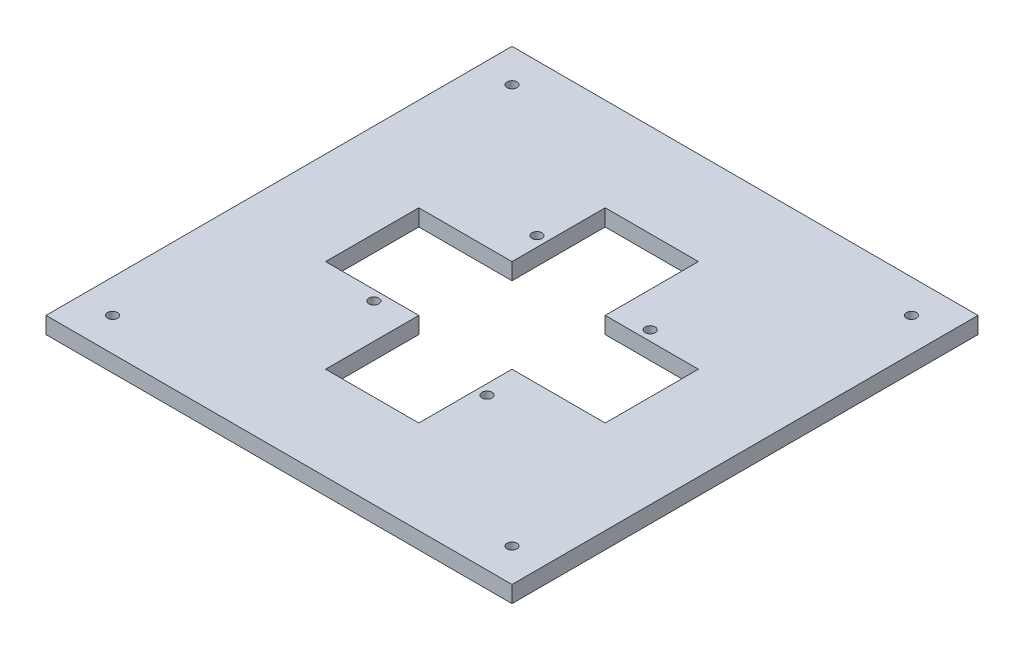
ISO-10303-21;
HEADER;
FILE_DESCRIPTION(('STEP AP214'),'2;1');
FILE_NAME('part.step','',(''),(''),'','','');
FILE_SCHEMA(('AUTOMOTIVE_DESIGN { 1 0 10303 214 1 1 1 1 }'));
ENDSEC;
DATA;
#1=APPLICATION_CONTEXT('core data for automotive mechanical design processes');
#2=APPLICATION_PROTOCOL_DEFINITION('international standard','automotive_design',2000,#1);
#3=PRODUCT_CONTEXT('',#1,'mechanical');
#4=PRODUCT('Part','Part','',(#3));
#5=PRODUCT_RELATED_PRODUCT_CATEGORY('part','',(#4));
#6=PRODUCT_DEFINITION_FORMATION('','',#4);
#7=PRODUCT_DEFINITION_CONTEXT('part definition',#1,'design');
#8=PRODUCT_DEFINITION('design','',#6,#7);
#9=PRODUCT_DEFINITION_SHAPE('','',#8);
#10=(LENGTH_UNIT() NAMED_UNIT(*) SI_UNIT(.MILLI.,.METRE.));
#11=(NAMED_UNIT(*) PLANE_ANGLE_UNIT() SI_UNIT($,.RADIAN.));
#12=(NAMED_UNIT(*) SI_UNIT($,.STERADIAN.) SOLID_ANGLE_UNIT());
#13=UNCERTAINTY_MEASURE_WITH_UNIT(LENGTH_MEASURE(1.E-05),#10,'distance_accuracy_value','');
#14=(GEOMETRIC_REPRESENTATION_CONTEXT(3) GLOBAL_UNCERTAINTY_ASSIGNED_CONTEXT((#13)) GLOBAL_UNIT_ASSIGNED_CONTEXT((#10,
#11,#12)) REPRESENTATION_CONTEXT('',''));
#15=CARTESIAN_POINT('',(0.,0.,0.));
#16=DIRECTION('',(0.,0.,1.));
#17=DIRECTION('',(1.,0.,0.));
#18=AXIS2_PLACEMENT_3D('',#15,#16,#17);
#19=CARTESIAN_POINT('',(70.,5.,-70.));
#20=DIRECTION('',(-1.,0.,0.));
#21=DIRECTION('',(0.,0.,1.));
#22=AXIS2_PLACEMENT_3D('',#19,#20,#21);
#23=PLANE('',#22);
#24=DIRECTION('',(0.,0.,-1.));
#25=VECTOR('',#24,1.);
#26=CARTESIAN_POINT('',(70.,0.,-70.));
#27=LINE('',#26,#25);
#28=CARTESIAN_POINT('',(70.,0.,70.));
#29=VERTEX_POINT('',#28);
#30=CARTESIAN_POINT('',(70.,0.,-70.));
#31=VERTEX_POINT('',#30);
#32=EDGE_CURVE('E224',#29,#31,#27,.T.);
#33=ORIENTED_EDGE('',*,*,#32,.T.);
#34=DIRECTION('',(0.,-1.,0.));
#35=VECTOR('',#34,1.);
#36=CARTESIAN_POINT('',(70.,5.,-70.));
#37=LINE('',#36,#35);
#38=CARTESIAN_POINT('',(70.,5.,-70.));
#39=VERTEX_POINT('',#38);
#40=EDGE_CURVE('E11',#39,#31,#37,.T.);
#41=ORIENTED_EDGE('',*,*,#40,.F.);
#42=DIRECTION('',(0.,0.,-1.));
#43=VECTOR('',#42,1.);
#44=CARTESIAN_POINT('',(70.,5.,-70.));
#45=LINE('',#44,#43);
#46=CARTESIAN_POINT('',(70.,5.,70.));
#47=VERTEX_POINT('',#46);
#48=EDGE_CURVE('E241',#47,#39,#45,.T.);
#49=ORIENTED_EDGE('',*,*,#48,.F.);
#50=DIRECTION('',(0.,-1.,0.));
#51=VECTOR('',#50,1.);
#52=CARTESIAN_POINT('',(70.,5.,70.));
#53=LINE('',#52,#51);
#54=EDGE_CURVE('E251',#47,#29,#53,.T.);
#55=ORIENTED_EDGE('',*,*,#54,.T.);
#56=EDGE_LOOP('',(#33,#41,#49,#55));
#57=FACE_BOUND('',#56,.T.);
#58=ADVANCED_FACE('F32',(#57),#23,.F.);
#59=CARTESIAN_POINT('',(-70.,5.,-70.));
#60=DIRECTION('',(0.,0.,1.));
#61=DIRECTION('',(1.,0.,0.));
#62=AXIS2_PLACEMENT_3D('',#59,#60,#61);
#63=PLANE('',#62);
#64=DIRECTION('',(-1.,0.,0.));
#65=VECTOR('',#64,1.);
#66=CARTESIAN_POINT('',(-70.,0.,-70.));
#67=LINE('',#66,#65);
#68=CARTESIAN_POINT('',(-70.,0.,-70.));
#69=VERTEX_POINT('',#68);
#70=EDGE_CURVE('E254',#31,#69,#67,.T.);
#71=ORIENTED_EDGE('',*,*,#70,.T.);
#72=DIRECTION('',(0.,-1.,0.));
#73=VECTOR('',#72,1.);
#74=CARTESIAN_POINT('',(-70.,5.,-70.));
#75=LINE('',#74,#73);
#76=CARTESIAN_POINT('',(-70.,5.,-70.));
#77=VERTEX_POINT('',#76);
#78=EDGE_CURVE('E39',#77,#69,#75,.T.);
#79=ORIENTED_EDGE('',*,*,#78,.F.);
#80=DIRECTION('',(-1.,0.,0.));
#81=VECTOR('',#80,1.);
#82=CARTESIAN_POINT('',(-70.,5.,-70.));
#83=LINE('',#82,#81);
#84=EDGE_CURVE('E244',#39,#77,#83,.T.);
#85=ORIENTED_EDGE('',*,*,#84,.F.);
#86=ORIENTED_EDGE('',*,*,#40,.T.);
#87=EDGE_LOOP('',(#71,#79,#85,#86));
#88=FACE_BOUND('',#87,.T.);
#89=ADVANCED_FACE('F283',(#88),#63,.F.);
#90=CARTESIAN_POINT('',(-70.,5.,-70.));
#91=DIRECTION('',(1.,0.,0.));
#92=DIRECTION('',(0.,0.,-1.));
#93=AXIS2_PLACEMENT_3D('',#90,#91,#92);
#94=PLANE('',#93);
#95=DIRECTION('',(0.,0.,1.));
#96=VECTOR('',#95,1.);
#97=CARTESIAN_POINT('',(-70.,0.,-70.));
#98=LINE('',#97,#96);
#99=CARTESIAN_POINT('',(-70.,0.,70.));
#100=VERTEX_POINT('',#99);
#101=EDGE_CURVE('E256',#69,#100,#98,.T.);
#102=ORIENTED_EDGE('',*,*,#101,.T.);
#103=DIRECTION('',(0.,-1.,0.));
#104=VECTOR('',#103,1.);
#105=CARTESIAN_POINT('',(-70.,5.,70.));
#106=LINE('',#105,#104);
#107=CARTESIAN_POINT('',(-70.,5.,70.));
#108=VERTEX_POINT('',#107);
#109=EDGE_CURVE('E261',#108,#100,#106,.T.);
#110=ORIENTED_EDGE('',*,*,#109,.F.);
#111=DIRECTION('',(0.,0.,1.));
#112=VECTOR('',#111,1.);
#113=CARTESIAN_POINT('',(-70.,5.,-70.));
#114=LINE('',#113,#112);
#115=EDGE_CURVE('E247',#77,#108,#114,.T.);
#116=ORIENTED_EDGE('',*,*,#115,.F.);
#117=ORIENTED_EDGE('',*,*,#78,.T.);
#118=EDGE_LOOP('',(#102,#110,#116,#117));
#119=FACE_BOUND('',#118,.T.);
#120=ADVANCED_FACE('F268',(#119),#94,.F.);
#121=CARTESIAN_POINT('',(-70.,5.,70.));
#122=DIRECTION('',(0.,0.,-1.));
#123=DIRECTION('',(-1.,0.,0.));
#124=AXIS2_PLACEMENT_3D('',#121,#122,#123);
#125=PLANE('',#124);
#126=DIRECTION('',(1.,0.,0.));
#127=VECTOR('',#126,1.);
#128=CARTESIAN_POINT('',(-70.,0.,70.));
#129=LINE('',#128,#127);
#130=EDGE_CURVE('E245',#100,#29,#129,.T.);
#131=ORIENTED_EDGE('',*,*,#130,.T.);
#132=ORIENTED_EDGE('',*,*,#54,.F.);
#133=DIRECTION('',(1.,0.,0.));
#134=VECTOR('',#133,1.);
#135=CARTESIAN_POINT('',(-70.,5.,70.));
#136=LINE('',#135,#134);
#137=EDGE_CURVE('E249',#108,#47,#136,.T.);
#138=ORIENTED_EDGE('',*,*,#137,.F.);
#139=ORIENTED_EDGE('',*,*,#109,.T.);
#140=EDGE_LOOP('',(#131,#132,#138,#139));
#141=FACE_BOUND('',#140,.T.);
#142=ADVANCED_FACE('F277',(#141),#125,.F.);
#143=CARTESIAN_POINT('',(0.,5.,0.));
#144=DIRECTION('',(0.,1.,0.));
#145=DIRECTION('',(0.,0.,1.));
#146=AXIS2_PLACEMENT_3D('',#143,#144,#145);
#147=PLANE('',#146);
#148=CARTESIAN_POINT('',(-60.,5.,60.));
#149=DIRECTION('',(0.,1.,0.));
#150=DIRECTION('',(0.,0.,1.));
#151=AXIS2_PLACEMENT_3D('',#148,#149,#150);
#152=CIRCLE('',#151,1.5);
#153=CARTESIAN_POINT('',(-60.,5.,61.5));
#154=VERTEX_POINT('',#153);
#155=EDGE_CURVE('E394',#154,#154,#152,.T.);
#156=ORIENTED_EDGE('',*,*,#155,.F.);
#157=EDGE_LOOP('',(#156));
#158=FACE_BOUND('',#157,.T.);
#159=CARTESIAN_POINT('',(60.,5.,60.));
#160=DIRECTION('',(0.,1.,0.));
#161=DIRECTION('',(0.,0.,1.));
#162=AXIS2_PLACEMENT_3D('',#159,#160,#161);
#163=CIRCLE('',#162,1.49999999999999);
#164=CARTESIAN_POINT('',(60.,5.,61.5));
#165=VERTEX_POINT('',#164);
#166=EDGE_CURVE('E388',#165,#165,#163,.T.);
#167=ORIENTED_EDGE('',*,*,#166,.F.);
#168=EDGE_LOOP('',(#167));
#169=FACE_BOUND('',#168,.T.);
#170=CARTESIAN_POINT('',(60.,5.,-60.));
#171=DIRECTION('',(0.,1.,0.));
#172=DIRECTION('',(0.,0.,1.));
#173=AXIS2_PLACEMENT_3D('',#170,#171,#172);
#174=CIRCLE('',#173,1.5);
#175=CARTESIAN_POINT('',(60.,5.,-58.5));
#176=VERTEX_POINT('',#175);
#177=EDGE_CURVE('E381',#176,#176,#174,.T.);
#178=ORIENTED_EDGE('',*,*,#177,.F.);
#179=EDGE_LOOP('',(#178));
#180=FACE_BOUND('',#179,.T.);
#181=CARTESIAN_POINT('',(-60.,5.,-60.));
#182=DIRECTION('',(0.,1.,0.));
#183=DIRECTION('',(0.,0.,1.));
#184=AXIS2_PLACEMENT_3D('',#181,#182,#183);
#185=CIRCLE('',#184,1.5);
#186=CARTESIAN_POINT('',(-60.,5.,-58.5));
#187=VERTEX_POINT('',#186);
#188=EDGE_CURVE('E385',#187,#187,#185,.T.);
#189=ORIENTED_EDGE('',*,*,#188,.F.);
#190=EDGE_LOOP('',(#189));
#191=FACE_BOUND('',#190,.T.);
#192=DIRECTION('',(-1.,0.,0.));
#193=VECTOR('',#192,1.);
#194=CARTESIAN_POINT('',(14.,5.,-14.));
#195=LINE('',#194,#193);
#196=CARTESIAN_POINT('',(42.,5.,-14.));
#197=VERTEX_POINT('',#196);
#198=CARTESIAN_POINT('',(14.,5.,-14.));
#199=VERTEX_POINT('',#198);
#200=EDGE_CURVE('E46',#197,#199,#195,.T.);
#201=ORIENTED_EDGE('',*,*,#200,.F.);
#202=DIRECTION('',(0.,0.,-1.));
#203=VECTOR('',#202,1.);
#204=CARTESIAN_POINT('',(42.,5.,-14.));
#205=LINE('',#204,#203);
#206=CARTESIAN_POINT('',(42.,5.,14.));
#207=VERTEX_POINT('',#206);
#208=EDGE_CURVE('E190',#207,#197,#205,.T.);
#209=ORIENTED_EDGE('',*,*,#208,.F.);
#210=DIRECTION('',(1.,0.,0.));
#211=VECTOR('',#210,1.);
#212=CARTESIAN_POINT('',(42.,5.,14.));
#213=LINE('',#212,#211);
#214=CARTESIAN_POINT('',(14.,5.,14.));
#215=VERTEX_POINT('',#214);
#216=EDGE_CURVE('E187',#215,#207,#213,.T.);
#217=ORIENTED_EDGE('',*,*,#216,.F.);
#218=DIRECTION('',(0.,0.,-1.));
#219=VECTOR('',#218,1.);
#220=CARTESIAN_POINT('',(14.,5.,14.));
#221=LINE('',#220,#219);
#222=CARTESIAN_POINT('',(14.,5.,42.));
#223=VERTEX_POINT('',#222);
#224=EDGE_CURVE('E184',#223,#215,#221,.T.);
#225=ORIENTED_EDGE('',*,*,#224,.F.);
#226=DIRECTION('',(1.,0.,0.));
#227=VECTOR('',#226,1.);
#228=CARTESIAN_POINT('',(14.,5.,42.));
#229=LINE('',#228,#227);
#230=CARTESIAN_POINT('',(-14.,5.,42.));
#231=VERTEX_POINT('',#230);
#232=EDGE_CURVE('E181',#231,#223,#229,.T.);
#233=ORIENTED_EDGE('',*,*,#232,.F.);
#234=DIRECTION('',(0.,0.,1.));
#235=VECTOR('',#234,1.);
#236=CARTESIAN_POINT('',(-14.,5.,42.));
#237=LINE('',#236,#235);
#238=CARTESIAN_POINT('',(-14.,5.,14.));
#239=VERTEX_POINT('',#238);
#240=EDGE_CURVE('E178',#239,#231,#237,.T.);
#241=ORIENTED_EDGE('',*,*,#240,.F.);
#242=DIRECTION('',(1.,0.,0.));
#243=VECTOR('',#242,1.);
#244=CARTESIAN_POINT('',(-14.,5.,14.));
#245=LINE('',#244,#243);
#246=CARTESIAN_POINT('',(-42.,5.,14.));
#247=VERTEX_POINT('',#246);
#248=EDGE_CURVE('E175',#247,#239,#245,.T.);
#249=ORIENTED_EDGE('',*,*,#248,.F.);
#250=DIRECTION('',(0.,0.,1.));
#251=VECTOR('',#250,1.);
#252=CARTESIAN_POINT('',(-42.,5.,14.));
#253=LINE('',#252,#251);
#254=CARTESIAN_POINT('',(-42.,5.,-14.));
#255=VERTEX_POINT('',#254);
#256=EDGE_CURVE('E172',#255,#247,#253,.T.);
#257=ORIENTED_EDGE('',*,*,#256,.F.);
#258=DIRECTION('',(-1.,0.,0.));
#259=VECTOR('',#258,1.);
#260=CARTESIAN_POINT('',(-42.,5.,-14.));
#261=LINE('',#260,#259);
#262=CARTESIAN_POINT('',(-14.,5.,-14.));
#263=VERTEX_POINT('',#262);
#264=EDGE_CURVE('E166',#263,#255,#261,.T.);
#265=ORIENTED_EDGE('',*,*,#264,.F.);
#266=DIRECTION('',(0.,0.,1.));
#267=VECTOR('',#266,1.);
#268=CARTESIAN_POINT('',(-14.,5.,-42.));
#269=LINE('',#268,#267);
#270=CARTESIAN_POINT('',(-14.,5.,-42.));
#271=VERTEX_POINT('',#270);
#272=EDGE_CURVE('E164',#271,#263,#269,.T.);
#273=ORIENTED_EDGE('',*,*,#272,.F.);
#274=DIRECTION('',(-1.,0.,0.));
#275=VECTOR('',#274,1.);
#276=CARTESIAN_POINT('',(-14.,5.,-42.));
#277=LINE('',#276,#275);
#278=CARTESIAN_POINT('',(14.,5.,-42.));
#279=VERTEX_POINT('',#278);
#280=EDGE_CURVE('E147',#279,#271,#277,.T.);
#281=ORIENTED_EDGE('',*,*,#280,.F.);
#282=DIRECTION('',(0.,0.,-1.));
#283=VECTOR('',#282,1.);
#284=CARTESIAN_POINT('',(14.,5.,-42.));
#285=LINE('',#284,#283);
#286=EDGE_CURVE('E156',#199,#279,#285,.T.);
#287=ORIENTED_EDGE('',*,*,#286,.F.);
#288=EDGE_LOOP('',(#201,#209,#217,#225,#233,#241,#249,#257,#265,#273,#281,#287));
#289=FACE_BOUND('',#288,.T.);
#290=CARTESIAN_POINT('',(24.505,5.,-17.0050000000008));
#291=DIRECTION('',(0.,1.,0.));
#292=DIRECTION('',(0.,0.,1.));
#293=AXIS2_PLACEMENT_3D('',#290,#291,#292);
#294=CIRCLE('',#293,1.5);
#295=CARTESIAN_POINT('',(24.505,5.,-15.5050000000008));
#296=VERTEX_POINT('',#295);
#297=EDGE_CURVE('E220',#296,#296,#294,.F.);
#298=ORIENTED_EDGE('',*,*,#297,.T.);
#299=EDGE_LOOP('',(#298));
#300=FACE_BOUND('',#299,.T.);
#301=CARTESIAN_POINT('',(-17.005,5.,-24.5050000000008));
#302=DIRECTION('',(0.,1.,0.));
#303=DIRECTION('',(0.,0.,1.));
#304=AXIS2_PLACEMENT_3D('',#301,#302,#303);
#305=CIRCLE('',#304,1.5);
#306=CARTESIAN_POINT('',(-17.005,5.,-23.0050000000008));
#307=VERTEX_POINT('',#306);
#308=EDGE_CURVE('E221',#307,#307,#305,.F.);
#309=ORIENTED_EDGE('',*,*,#308,.T.);
#310=EDGE_LOOP('',(#309));
#311=FACE_BOUND('',#310,.T.);
#312=CARTESIAN_POINT('',(-24.505,5.,17.0049999999992));
#313=DIRECTION('',(0.,1.,0.));
#314=DIRECTION('',(0.,0.,1.));
#315=AXIS2_PLACEMENT_3D('',#312,#313,#314);
#316=CIRCLE('',#315,1.5);
#317=CARTESIAN_POINT('',(-24.505,5.,18.5049999999992));
#318=VERTEX_POINT('',#317);
#319=EDGE_CURVE('E228',#318,#318,#316,.F.);
#320=ORIENTED_EDGE('',*,*,#319,.T.);
#321=EDGE_LOOP('',(#320));
#322=FACE_BOUND('',#321,.T.);
#323=CARTESIAN_POINT('',(17.005,5.,24.5049999999992));
#324=DIRECTION('',(0.,1.,0.));
#325=DIRECTION('',(0.,0.,1.));
#326=AXIS2_PLACEMENT_3D('',#323,#324,#325);
#327=CIRCLE('',#326,1.5);
#328=CARTESIAN_POINT('',(17.005,5.,26.0049999999992));
#329=VERTEX_POINT('',#328);
#330=EDGE_CURVE('E234',#329,#329,#327,.F.);
#331=ORIENTED_EDGE('',*,*,#330,.T.);
#332=EDGE_LOOP('',(#331));
#333=FACE_BOUND('',#332,.T.);
#334=ORIENTED_EDGE('',*,*,#48,.T.);
#335=ORIENTED_EDGE('',*,*,#84,.T.);
#336=ORIENTED_EDGE('',*,*,#115,.T.);
#337=ORIENTED_EDGE('',*,*,#137,.T.);
#338=EDGE_LOOP('',(#334,#335,#336,#337));
#339=FACE_BOUND('',#338,.T.);
#340=ADVANCED_FACE('F160',(#158,#169,#180,#191,#289,#300,#311,#322,#333,#339),#147,.T.);
#341=CARTESIAN_POINT('',(0.,0.,0.));
#342=DIRECTION('',(0.,1.,0.));
#343=DIRECTION('',(0.,0.,1.));
#344=AXIS2_PLACEMENT_3D('',#341,#342,#343);
#345=PLANE('',#344);
#346=CARTESIAN_POINT('',(-60.,0.,60.));
#347=DIRECTION('',(0.,1.,0.));
#348=DIRECTION('',(0.,0.,1.));
#349=AXIS2_PLACEMENT_3D('',#346,#347,#348);
#350=CIRCLE('',#349,1.5);
#351=CARTESIAN_POINT('',(-60.,0.,61.5));
#352=VERTEX_POINT('',#351);
#353=EDGE_CURVE('E392',#352,#352,#350,.F.);
#354=ORIENTED_EDGE('',*,*,#353,.F.);
#355=EDGE_LOOP('',(#354));
#356=FACE_BOUND('',#355,.T.);
#357=CARTESIAN_POINT('',(60.,0.,60.));
#358=DIRECTION('',(0.,1.,0.));
#359=DIRECTION('',(0.,0.,1.));
#360=AXIS2_PLACEMENT_3D('',#357,#358,#359);
#361=CIRCLE('',#360,1.49999999999999);
#362=CARTESIAN_POINT('',(60.,0.,61.5));
#363=VERTEX_POINT('',#362);
#364=EDGE_CURVE('E383',#363,#363,#361,.F.);
#365=ORIENTED_EDGE('',*,*,#364,.F.);
#366=EDGE_LOOP('',(#365));
#367=FACE_BOUND('',#366,.T.);
#368=CARTESIAN_POINT('',(60.,0.,-60.));
#369=DIRECTION('',(0.,1.,0.));
#370=DIRECTION('',(0.,0.,1.));
#371=AXIS2_PLACEMENT_3D('',#368,#369,#370);
#372=CIRCLE('',#371,1.5);
#373=CARTESIAN_POINT('',(60.,0.,-58.5));
#374=VERTEX_POINT('',#373);
#375=EDGE_CURVE('E378',#374,#374,#372,.F.);
#376=ORIENTED_EDGE('',*,*,#375,.F.);
#377=EDGE_LOOP('',(#376));
#378=FACE_BOUND('',#377,.T.);
#379=CARTESIAN_POINT('',(-60.,0.,-60.));
#380=DIRECTION('',(0.,1.,0.));
#381=DIRECTION('',(0.,0.,1.));
#382=AXIS2_PLACEMENT_3D('',#379,#380,#381);
#383=CIRCLE('',#382,1.5);
#384=CARTESIAN_POINT('',(-60.,0.,-58.5));
#385=VERTEX_POINT('',#384);
#386=EDGE_CURVE('E401',#385,#385,#383,.F.);
#387=ORIENTED_EDGE('',*,*,#386,.F.);
#388=EDGE_LOOP('',(#387));
#389=FACE_BOUND('',#388,.T.);
#390=DIRECTION('',(0.,0.,1.));
#391=VECTOR('',#390,1.);
#392=CARTESIAN_POINT('',(42.,0.,-14.));
#393=LINE('',#392,#391);
#394=CARTESIAN_POINT('',(42.,0.,-14.));
#395=VERTEX_POINT('',#394);
#396=CARTESIAN_POINT('',(42.,0.,14.));
#397=VERTEX_POINT('',#396);
#398=EDGE_CURVE('E421',#395,#397,#393,.T.);
#399=ORIENTED_EDGE('',*,*,#398,.F.);
#400=DIRECTION('',(1.,0.,0.));
#401=VECTOR('',#400,1.);
#402=CARTESIAN_POINT('',(14.,0.,-14.));
#403=LINE('',#402,#401);
#404=CARTESIAN_POINT('',(14.,0.,-14.));
#405=VERTEX_POINT('',#404);
#406=EDGE_CURVE('E216',#405,#395,#403,.T.);
#407=ORIENTED_EDGE('',*,*,#406,.F.);
#408=DIRECTION('',(0.,0.,1.));
#409=VECTOR('',#408,1.);
#410=CARTESIAN_POINT('',(14.,0.,-42.));
#411=LINE('',#410,#409);
#412=CARTESIAN_POINT('',(14.,0.,-42.));
#413=VERTEX_POINT('',#412);
#414=EDGE_CURVE('E213',#413,#405,#411,.T.);
#415=ORIENTED_EDGE('',*,*,#414,.F.);
#416=DIRECTION('',(1.,0.,0.));
#417=VECTOR('',#416,1.);
#418=CARTESIAN_POINT('',(-14.,0.,-42.));
#419=LINE('',#418,#417);
#420=CARTESIAN_POINT('',(-14.,0.,-42.));
#421=VERTEX_POINT('',#420);
#422=EDGE_CURVE('E150',#421,#413,#419,.T.);
#423=ORIENTED_EDGE('',*,*,#422,.F.);
#424=DIRECTION('',(0.,0.,-1.));
#425=VECTOR('',#424,1.);
#426=CARTESIAN_POINT('',(-14.,0.,-42.));
#427=LINE('',#426,#425);
#428=CARTESIAN_POINT('',(-14.,0.,-14.));
#429=VERTEX_POINT('',#428);
#430=EDGE_CURVE('E405',#429,#421,#427,.T.);
#431=ORIENTED_EDGE('',*,*,#430,.F.);
#432=DIRECTION('',(1.,0.,0.));
#433=VECTOR('',#432,1.);
#434=CARTESIAN_POINT('',(-42.,0.,-14.));
#435=LINE('',#434,#433);
#436=CARTESIAN_POINT('',(-42.,0.,-14.));
#437=VERTEX_POINT('',#436);
#438=EDGE_CURVE('E407',#437,#429,#435,.T.);
#439=ORIENTED_EDGE('',*,*,#438,.F.);
#440=DIRECTION('',(0.,0.,-1.));
#441=VECTOR('',#440,1.);
#442=CARTESIAN_POINT('',(-42.,0.,14.));
#443=LINE('',#442,#441);
#444=CARTESIAN_POINT('',(-42.,0.,14.));
#445=VERTEX_POINT('',#444);
#446=EDGE_CURVE('E409',#445,#437,#443,.T.);
#447=ORIENTED_EDGE('',*,*,#446,.F.);
#448=DIRECTION('',(-1.,0.,0.));
#449=VECTOR('',#448,1.);
#450=CARTESIAN_POINT('',(-14.,0.,14.));
#451=LINE('',#450,#449);
#452=CARTESIAN_POINT('',(-14.,0.,14.));
#453=VERTEX_POINT('',#452);
#454=EDGE_CURVE('E411',#453,#445,#451,.T.);
#455=ORIENTED_EDGE('',*,*,#454,.F.);
#456=DIRECTION('',(0.,0.,-1.));
#457=VECTOR('',#456,1.);
#458=CARTESIAN_POINT('',(-14.,0.,42.));
#459=LINE('',#458,#457);
#460=CARTESIAN_POINT('',(-14.,0.,42.));
#461=VERTEX_POINT('',#460);
#462=EDGE_CURVE('E413',#461,#453,#459,.T.);
#463=ORIENTED_EDGE('',*,*,#462,.F.);
#464=DIRECTION('',(-1.,0.,0.));
#465=VECTOR('',#464,1.);
#466=CARTESIAN_POINT('',(14.,0.,42.));
#467=LINE('',#466,#465);
#468=CARTESIAN_POINT('',(14.,0.,42.));
#469=VERTEX_POINT('',#468);
#470=EDGE_CURVE('E415',#469,#461,#467,.T.);
#471=ORIENTED_EDGE('',*,*,#470,.F.);
#472=DIRECTION('',(0.,0.,1.));
#473=VECTOR('',#472,1.);
#474=CARTESIAN_POINT('',(14.,0.,14.));
#475=LINE('',#474,#473);
#476=CARTESIAN_POINT('',(14.,0.,14.));
#477=VERTEX_POINT('',#476);
#478=EDGE_CURVE('E417',#477,#469,#475,.T.);
#479=ORIENTED_EDGE('',*,*,#478,.F.);
#480=DIRECTION('',(-1.,0.,0.));
#481=VECTOR('',#480,1.);
#482=CARTESIAN_POINT('',(42.,0.,14.));
#483=LINE('',#482,#481);
#484=EDGE_CURVE('E419',#397,#477,#483,.T.);
#485=ORIENTED_EDGE('',*,*,#484,.F.);
#486=EDGE_LOOP('',(#399,#407,#415,#423,#431,#439,#447,#455,#463,#471,#479,#485));
#487=FACE_BOUND('',#486,.T.);
#488=CARTESIAN_POINT('',(24.505,0.,-17.0050000000008));
#489=DIRECTION('',(0.,-1.,0.));
#490=DIRECTION('',(0.,0.,-1.));
#491=AXIS2_PLACEMENT_3D('',#488,#489,#490);
#492=CIRCLE('',#491,1.5);
#493=CARTESIAN_POINT('',(24.505,0.,-18.5050000000008));
#494=VERTEX_POINT('',#493);
#495=EDGE_CURVE('E217',#494,#494,#492,.T.);
#496=ORIENTED_EDGE('',*,*,#495,.F.);
#497=EDGE_LOOP('',(#496));
#498=FACE_BOUND('',#497,.T.);
#499=CARTESIAN_POINT('',(-17.005,0.,-24.5050000000008));
#500=DIRECTION('',(0.,-1.,0.));
#501=DIRECTION('',(0.,0.,-1.));
#502=AXIS2_PLACEMENT_3D('',#499,#500,#501);
#503=CIRCLE('',#502,1.5);
#504=CARTESIAN_POINT('',(-17.005,0.,-26.0050000000008));
#505=VERTEX_POINT('',#504);
#506=EDGE_CURVE('E225',#505,#505,#503,.T.);
#507=ORIENTED_EDGE('',*,*,#506,.F.);
#508=EDGE_LOOP('',(#507));
#509=FACE_BOUND('',#508,.T.);
#510=CARTESIAN_POINT('',(-24.505,0.,17.0049999999992));
#511=DIRECTION('',(0.,-1.,0.));
#512=DIRECTION('',(0.,0.,-1.));
#513=AXIS2_PLACEMENT_3D('',#510,#511,#512);
#514=CIRCLE('',#513,1.5);
#515=CARTESIAN_POINT('',(-24.505,0.,15.5049999999992));
#516=VERTEX_POINT('',#515);
#517=EDGE_CURVE('E231',#516,#516,#514,.T.);
#518=ORIENTED_EDGE('',*,*,#517,.F.);
#519=EDGE_LOOP('',(#518));
#520=FACE_BOUND('',#519,.T.);
#521=CARTESIAN_POINT('',(17.005,0.,24.5049999999992));
#522=DIRECTION('',(0.,-1.,0.));
#523=DIRECTION('',(0.,0.,-1.));
#524=AXIS2_PLACEMENT_3D('',#521,#522,#523);
#525=CIRCLE('',#524,1.5);
#526=CARTESIAN_POINT('',(17.005,0.,23.0049999999992));
#527=VERTEX_POINT('',#526);
#528=EDGE_CURVE('E215',#527,#527,#525,.T.);
#529=ORIENTED_EDGE('',*,*,#528,.F.);
#530=EDGE_LOOP('',(#529));
#531=FACE_BOUND('',#530,.T.);
#532=ORIENTED_EDGE('',*,*,#32,.F.);
#533=ORIENTED_EDGE('',*,*,#130,.F.);
#534=ORIENTED_EDGE('',*,*,#101,.F.);
#535=ORIENTED_EDGE('',*,*,#70,.F.);
#536=EDGE_LOOP('',(#532,#533,#534,#535));
#537=FACE_BOUND('',#536,.T.);
#538=ADVANCED_FACE('F274',(#356,#367,#378,#389,#487,#498,#509,#520,#531,#537),#345,.F.);
#539=CARTESIAN_POINT('',(17.005,9.2426406871193,24.5049999999992));
#540=DIRECTION('',(0.,-1.,0.));
#541=DIRECTION('',(0.,0.,-1.));
#542=AXIS2_PLACEMENT_3D('',#539,#540,#541);
#543=CYLINDRICAL_SURFACE('',#542,1.5);
#544=ORIENTED_EDGE('',*,*,#528,.T.);
#545=EDGE_LOOP('',(#544));
#546=FACE_BOUND('',#545,.T.);
#547=ORIENTED_EDGE('',*,*,#330,.F.);
#548=EDGE_LOOP('',(#547));
#549=FACE_BOUND('',#548,.T.);
#550=ADVANCED_FACE('F295',(#546,#549),#543,.F.);
#551=CARTESIAN_POINT('',(-24.505,9.2426406871193,17.0049999999992));
#552=DIRECTION('',(0.,-1.,0.));
#553=DIRECTION('',(0.,0.,-1.));
#554=AXIS2_PLACEMENT_3D('',#551,#552,#553);
#555=CYLINDRICAL_SURFACE('',#554,1.5);
#556=ORIENTED_EDGE('',*,*,#517,.T.);
#557=EDGE_LOOP('',(#556));
#558=FACE_BOUND('',#557,.T.);
#559=ORIENTED_EDGE('',*,*,#319,.F.);
#560=EDGE_LOOP('',(#559));
#561=FACE_BOUND('',#560,.T.);
#562=ADVANCED_FACE('F302',(#558,#561),#555,.F.);
#563=CARTESIAN_POINT('',(-17.005,9.2426406871193,-24.5050000000008));
#564=DIRECTION('',(0.,-1.,0.));
#565=DIRECTION('',(0.,0.,-1.));
#566=AXIS2_PLACEMENT_3D('',#563,#564,#565);
#567=CYLINDRICAL_SURFACE('',#566,1.5);
#568=ORIENTED_EDGE('',*,*,#506,.T.);
#569=EDGE_LOOP('',(#568));
#570=FACE_BOUND('',#569,.T.);
#571=ORIENTED_EDGE('',*,*,#308,.F.);
#572=EDGE_LOOP('',(#571));
#573=FACE_BOUND('',#572,.T.);
#574=ADVANCED_FACE('F306',(#570,#573),#567,.F.);
#575=CARTESIAN_POINT('',(24.505,9.2426406871193,-17.0050000000008));
#576=DIRECTION('',(0.,-1.,0.));
#577=DIRECTION('',(0.,0.,-1.));
#578=AXIS2_PLACEMENT_3D('',#575,#576,#577);
#579=CYLINDRICAL_SURFACE('',#578,1.5);
#580=ORIENTED_EDGE('',*,*,#495,.T.);
#581=EDGE_LOOP('',(#580));
#582=FACE_BOUND('',#581,.T.);
#583=ORIENTED_EDGE('',*,*,#297,.F.);
#584=EDGE_LOOP('',(#583));
#585=FACE_BOUND('',#584,.T.);
#586=ADVANCED_FACE('F310',(#582,#585),#579,.F.);
#587=CARTESIAN_POINT('',(14.,-118.79393923934,-14.));
#588=DIRECTION('',(0.,0.,-1.));
#589=DIRECTION('',(-1.,0.,0.));
#590=AXIS2_PLACEMENT_3D('',#587,#588,#589);
#591=PLANE('',#590);
#592=ORIENTED_EDGE('',*,*,#406,.T.);
#593=DIRECTION('',(0.,1.,0.));
#594=VECTOR('',#593,1.);
#595=CARTESIAN_POINT('',(42.,-118.79393923934,-14.));
#596=LINE('',#595,#594);
#597=EDGE_CURVE('E193',#395,#197,#596,.T.);
#598=ORIENTED_EDGE('',*,*,#597,.T.);
#599=ORIENTED_EDGE('',*,*,#200,.T.);
#600=DIRECTION('',(0.,1.,0.));
#601=VECTOR('',#600,1.);
#602=CARTESIAN_POINT('',(14.,-118.79393923934,-14.));
#603=LINE('',#602,#601);
#604=EDGE_CURVE('E153',#405,#199,#603,.T.);
#605=ORIENTED_EDGE('',*,*,#604,.F.);
#606=EDGE_LOOP('',(#592,#598,#599,#605));
#607=FACE_BOUND('',#606,.T.);
#608=ADVANCED_FACE('F314',(#607),#591,.F.);
#609=CARTESIAN_POINT('',(42.,-118.79393923934,-14.));
#610=DIRECTION('',(1.,0.,0.));
#611=DIRECTION('',(0.,0.,-1.));
#612=AXIS2_PLACEMENT_3D('',#609,#610,#611);
#613=PLANE('',#612);
#614=ORIENTED_EDGE('',*,*,#398,.T.);
#615=DIRECTION('',(0.,1.,0.));
#616=VECTOR('',#615,1.);
#617=CARTESIAN_POINT('',(42.,-118.79393923934,14.));
#618=LINE('',#617,#616);
#619=EDGE_CURVE('E195',#397,#207,#618,.T.);
#620=ORIENTED_EDGE('',*,*,#619,.T.);
#621=ORIENTED_EDGE('',*,*,#208,.T.);
#622=ORIENTED_EDGE('',*,*,#597,.F.);
#623=EDGE_LOOP('',(#614,#620,#621,#622));
#624=FACE_BOUND('',#623,.T.);
#625=ADVANCED_FACE('F318',(#624),#613,.F.);
#626=CARTESIAN_POINT('',(42.,-118.79393923934,14.));
#627=DIRECTION('',(0.,0.,1.));
#628=DIRECTION('',(1.,0.,0.));
#629=AXIS2_PLACEMENT_3D('',#626,#627,#628);
#630=PLANE('',#629);
#631=ORIENTED_EDGE('',*,*,#484,.T.);
#632=DIRECTION('',(0.,1.,0.));
#633=VECTOR('',#632,1.);
#634=CARTESIAN_POINT('',(14.,-118.79393923934,14.));
#635=LINE('',#634,#633);
#636=EDGE_CURVE('E197',#477,#215,#635,.T.);
#637=ORIENTED_EDGE('',*,*,#636,.T.);
#638=ORIENTED_EDGE('',*,*,#216,.T.);
#639=ORIENTED_EDGE('',*,*,#619,.F.);
#640=EDGE_LOOP('',(#631,#637,#638,#639));
#641=FACE_BOUND('',#640,.T.);
#642=ADVANCED_FACE('F351',(#641),#630,.F.);
#643=CARTESIAN_POINT('',(14.,-118.79393923934,14.));
#644=DIRECTION('',(1.,0.,0.));
#645=DIRECTION('',(0.,0.,-1.));
#646=AXIS2_PLACEMENT_3D('',#643,#644,#645);
#647=PLANE('',#646);
#648=ORIENTED_EDGE('',*,*,#478,.T.);
#649=DIRECTION('',(0.,1.,0.));
#650=VECTOR('',#649,1.);
#651=CARTESIAN_POINT('',(14.,-118.79393923934,42.));
#652=LINE('',#651,#650);
#653=EDGE_CURVE('E199',#469,#223,#652,.T.);
#654=ORIENTED_EDGE('',*,*,#653,.T.);
#655=ORIENTED_EDGE('',*,*,#224,.T.);
#656=ORIENTED_EDGE('',*,*,#636,.F.);
#657=EDGE_LOOP('',(#648,#654,#655,#656));
#658=FACE_BOUND('',#657,.T.);
#659=ADVANCED_FACE('F347',(#658),#647,.F.);
#660=CARTESIAN_POINT('',(14.,-118.79393923934,42.));
#661=DIRECTION('',(0.,0.,1.));
#662=DIRECTION('',(1.,0.,0.));
#663=AXIS2_PLACEMENT_3D('',#660,#661,#662);
#664=PLANE('',#663);
#665=ORIENTED_EDGE('',*,*,#470,.T.);
#666=DIRECTION('',(0.,1.,0.));
#667=VECTOR('',#666,1.);
#668=CARTESIAN_POINT('',(-14.,-118.79393923934,42.));
#669=LINE('',#668,#667);
#670=EDGE_CURVE('E201',#461,#231,#669,.T.);
#671=ORIENTED_EDGE('',*,*,#670,.T.);
#672=ORIENTED_EDGE('',*,*,#232,.T.);
#673=ORIENTED_EDGE('',*,*,#653,.F.);
#674=EDGE_LOOP('',(#665,#671,#672,#673));
#675=FACE_BOUND('',#674,.T.);
#676=ADVANCED_FACE('F343',(#675),#664,.F.);
#677=CARTESIAN_POINT('',(-14.,-118.79393923934,42.));
#678=DIRECTION('',(-1.,0.,0.));
#679=DIRECTION('',(0.,0.,1.));
#680=AXIS2_PLACEMENT_3D('',#677,#678,#679);
#681=PLANE('',#680);
#682=ORIENTED_EDGE('',*,*,#462,.T.);
#683=DIRECTION('',(0.,1.,0.));
#684=VECTOR('',#683,1.);
#685=CARTESIAN_POINT('',(-14.,-118.79393923934,14.));
#686=LINE('',#685,#684);
#687=EDGE_CURVE('E203',#453,#239,#686,.T.);
#688=ORIENTED_EDGE('',*,*,#687,.T.);
#689=ORIENTED_EDGE('',*,*,#240,.T.);
#690=ORIENTED_EDGE('',*,*,#670,.F.);
#691=EDGE_LOOP('',(#682,#688,#689,#690));
#692=FACE_BOUND('',#691,.T.);
#693=ADVANCED_FACE('F339',(#692),#681,.F.);
#694=CARTESIAN_POINT('',(-14.,-118.79393923934,14.));
#695=DIRECTION('',(0.,0.,1.));
#696=DIRECTION('',(1.,0.,0.));
#697=AXIS2_PLACEMENT_3D('',#694,#695,#696);
#698=PLANE('',#697);
#699=ORIENTED_EDGE('',*,*,#454,.T.);
#700=DIRECTION('',(0.,1.,0.));
#701=VECTOR('',#700,1.);
#702=CARTESIAN_POINT('',(-42.,-118.79393923934,14.));
#703=LINE('',#702,#701);
#704=EDGE_CURVE('E205',#445,#247,#703,.T.);
#705=ORIENTED_EDGE('',*,*,#704,.T.);
#706=ORIENTED_EDGE('',*,*,#248,.T.);
#707=ORIENTED_EDGE('',*,*,#687,.F.);
#708=EDGE_LOOP('',(#699,#705,#706,#707));
#709=FACE_BOUND('',#708,.T.);
#710=ADVANCED_FACE('F335',(#709),#698,.F.);
#711=CARTESIAN_POINT('',(-42.,-118.79393923934,14.));
#712=DIRECTION('',(-1.,0.,0.));
#713=DIRECTION('',(0.,0.,1.));
#714=AXIS2_PLACEMENT_3D('',#711,#712,#713);
#715=PLANE('',#714);
#716=ORIENTED_EDGE('',*,*,#446,.T.);
#717=DIRECTION('',(0.,1.,0.));
#718=VECTOR('',#717,1.);
#719=CARTESIAN_POINT('',(-42.,-118.79393923934,-14.));
#720=LINE('',#719,#718);
#721=EDGE_CURVE('E207',#437,#255,#720,.T.);
#722=ORIENTED_EDGE('',*,*,#721,.T.);
#723=ORIENTED_EDGE('',*,*,#256,.T.);
#724=ORIENTED_EDGE('',*,*,#704,.F.);
#725=EDGE_LOOP('',(#716,#722,#723,#724));
#726=FACE_BOUND('',#725,.T.);
#727=ADVANCED_FACE('F331',(#726),#715,.F.);
#728=CARTESIAN_POINT('',(-42.,-118.79393923934,-14.));
#729=DIRECTION('',(0.,0.,-1.));
#730=DIRECTION('',(-1.,0.,0.));
#731=AXIS2_PLACEMENT_3D('',#728,#729,#730);
#732=PLANE('',#731);
#733=ORIENTED_EDGE('',*,*,#438,.T.);
#734=DIRECTION('',(0.,1.,0.));
#735=VECTOR('',#734,1.);
#736=CARTESIAN_POINT('',(-14.,-118.79393923934,-14.));
#737=LINE('',#736,#735);
#738=EDGE_CURVE('E209',#429,#263,#737,.T.);
#739=ORIENTED_EDGE('',*,*,#738,.T.);
#740=ORIENTED_EDGE('',*,*,#264,.T.);
#741=ORIENTED_EDGE('',*,*,#721,.F.);
#742=EDGE_LOOP('',(#733,#739,#740,#741));
#743=FACE_BOUND('',#742,.T.);
#744=ADVANCED_FACE('F327',(#743),#732,.F.);
#745=CARTESIAN_POINT('',(-14.,-118.79393923934,-42.));
#746=DIRECTION('',(-1.,0.,0.));
#747=DIRECTION('',(0.,0.,1.));
#748=AXIS2_PLACEMENT_3D('',#745,#746,#747);
#749=PLANE('',#748);
#750=ORIENTED_EDGE('',*,*,#430,.T.);
#751=DIRECTION('',(0.,1.,0.));
#752=VECTOR('',#751,1.);
#753=CARTESIAN_POINT('',(-14.,-118.79393923934,-42.));
#754=LINE('',#753,#752);
#755=EDGE_CURVE('E152',#421,#271,#754,.T.);
#756=ORIENTED_EDGE('',*,*,#755,.T.);
#757=ORIENTED_EDGE('',*,*,#272,.T.);
#758=ORIENTED_EDGE('',*,*,#738,.F.);
#759=EDGE_LOOP('',(#750,#756,#757,#758));
#760=FACE_BOUND('',#759,.T.);
#761=ADVANCED_FACE('F324',(#760),#749,.F.);
#762=CARTESIAN_POINT('',(-14.,-118.79393923934,-42.));
#763=DIRECTION('',(0.,0.,-1.));
#764=DIRECTION('',(-1.,0.,0.));
#765=AXIS2_PLACEMENT_3D('',#762,#763,#764);
#766=PLANE('',#765);
#767=ORIENTED_EDGE('',*,*,#422,.T.);
#768=DIRECTION('',(0.,1.,0.));
#769=VECTOR('',#768,1.);
#770=CARTESIAN_POINT('',(14.,-118.79393923934,-42.));
#771=LINE('',#770,#769);
#772=EDGE_CURVE('E54',#413,#279,#771,.T.);
#773=ORIENTED_EDGE('',*,*,#772,.T.);
#774=ORIENTED_EDGE('',*,*,#280,.T.);
#775=ORIENTED_EDGE('',*,*,#755,.F.);
#776=EDGE_LOOP('',(#767,#773,#774,#775));
#777=FACE_BOUND('',#776,.T.);
#778=ADVANCED_FACE('F144',(#777),#766,.F.);
#779=CARTESIAN_POINT('',(14.,-118.79393923934,-42.));
#780=DIRECTION('',(1.,0.,0.));
#781=DIRECTION('',(0.,0.,-1.));
#782=AXIS2_PLACEMENT_3D('',#779,#780,#781);
#783=PLANE('',#782);
#784=ORIENTED_EDGE('',*,*,#414,.T.);
#785=ORIENTED_EDGE('',*,*,#604,.T.);
#786=ORIENTED_EDGE('',*,*,#286,.T.);
#787=ORIENTED_EDGE('',*,*,#772,.F.);
#788=EDGE_LOOP('',(#784,#785,#786,#787));
#789=FACE_BOUND('',#788,.T.);
#790=ADVANCED_FACE('F157',(#789),#783,.F.);
#791=CARTESIAN_POINT('',(-60.,-4.24264068711927,-60.));
#792=DIRECTION('',(0.,1.,0.));
#793=DIRECTION('',(0.,0.,1.));
#794=AXIS2_PLACEMENT_3D('',#791,#792,#793);
#795=CYLINDRICAL_SURFACE('',#794,1.5);
#796=ORIENTED_EDGE('',*,*,#386,.T.);
#797=EDGE_LOOP('',(#796));
#798=FACE_BOUND('',#797,.T.);
#799=ORIENTED_EDGE('',*,*,#188,.T.);
#800=EDGE_LOOP('',(#799));
#801=FACE_BOUND('',#800,.T.);
#802=ADVANCED_FACE('F321',(#798,#801),#795,.F.);
#803=CARTESIAN_POINT('',(60.,-4.24264068711927,-60.));
#804=DIRECTION('',(0.,1.,0.));
#805=DIRECTION('',(0.,0.,1.));
#806=AXIS2_PLACEMENT_3D('',#803,#804,#805);
#807=CYLINDRICAL_SURFACE('',#806,1.5);
#808=ORIENTED_EDGE('',*,*,#375,.T.);
#809=EDGE_LOOP('',(#808));
#810=FACE_BOUND('',#809,.T.);
#811=ORIENTED_EDGE('',*,*,#177,.T.);
#812=EDGE_LOOP('',(#811));
#813=FACE_BOUND('',#812,.T.);
#814=ADVANCED_FACE('F361',(#810,#813),#807,.F.);
#815=CARTESIAN_POINT('',(60.,-4.24264068711927,60.));
#816=DIRECTION('',(0.,1.,0.));
#817=DIRECTION('',(0.,0.,1.));
#818=AXIS2_PLACEMENT_3D('',#815,#816,#817);
#819=CYLINDRICAL_SURFACE('',#818,1.49999999999999);
#820=ORIENTED_EDGE('',*,*,#364,.T.);
#821=EDGE_LOOP('',(#820));
#822=FACE_BOUND('',#821,.T.);
#823=ORIENTED_EDGE('',*,*,#166,.T.);
#824=EDGE_LOOP('',(#823));
#825=FACE_BOUND('',#824,.T.);
#826=ADVANCED_FACE('F366',(#822,#825),#819,.F.);
#827=CARTESIAN_POINT('',(-60.,-4.24264068711927,60.));
#828=DIRECTION('',(0.,1.,0.));
#829=DIRECTION('',(0.,0.,1.));
#830=AXIS2_PLACEMENT_3D('',#827,#828,#829);
#831=CYLINDRICAL_SURFACE('',#830,1.5);
#832=ORIENTED_EDGE('',*,*,#353,.T.);
#833=EDGE_LOOP('',(#832));
#834=FACE_BOUND('',#833,.T.);
#835=ORIENTED_EDGE('',*,*,#155,.T.);
#836=EDGE_LOOP('',(#835));
#837=FACE_BOUND('',#836,.T.);
#838=ADVANCED_FACE('F363',(#834,#837),#831,.F.);
#839=CLOSED_SHELL('',(#58,#89,#120,#142,#340,#538,#550,#562,#574,#586,#608,#625,#642,#659,#676,
#693,#710,#727,#744,#761,#778,#790,#802,#814,#826,#838));
#840=MANIFOLD_SOLID_BREP('B2',#839);
#841=ADVANCED_BREP_SHAPE_REPRESENTATION('',(#18,#840),#14);
#842=SHAPE_DEFINITION_REPRESENTATION(#9,#841);
ENDSEC;
END-ISO-10303-21;
